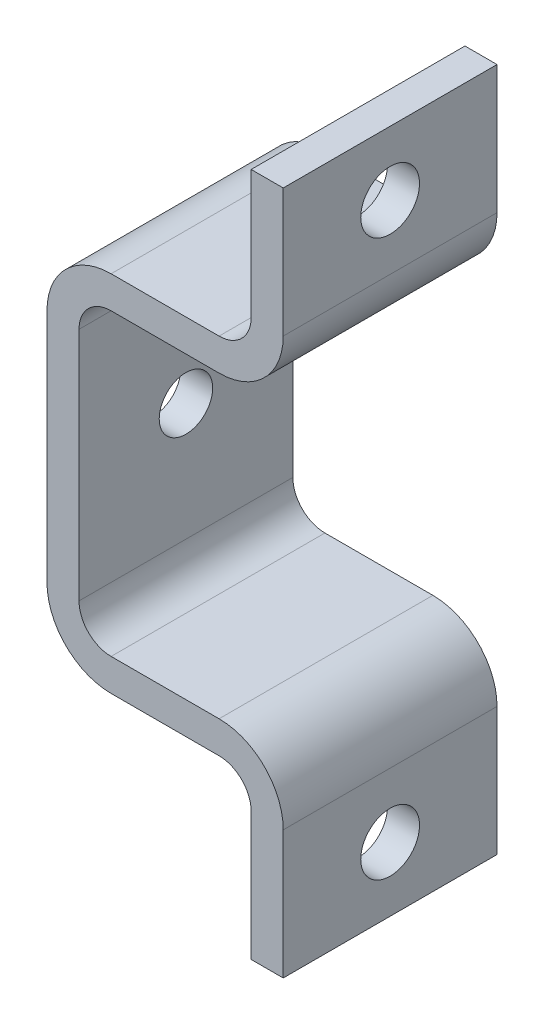
ISO-10303-21;
HEADER;
FILE_DESCRIPTION(('STEP AP214'),'2;1');
FILE_NAME('part.step','',(''),(''),'','','');
FILE_SCHEMA(('AUTOMOTIVE_DESIGN { 1 0 10303 214 1 1 1 1 }'));
ENDSEC;
DATA;
#1=APPLICATION_CONTEXT('core data for automotive mechanical design processes');
#2=APPLICATION_PROTOCOL_DEFINITION('international standard','automotive_design',2000,#1);
#3=PRODUCT_CONTEXT('',#1,'mechanical');
#4=PRODUCT('Part','Part','',(#3));
#5=PRODUCT_RELATED_PRODUCT_CATEGORY('part','',(#4));
#6=PRODUCT_DEFINITION_FORMATION('','',#4);
#7=PRODUCT_DEFINITION_CONTEXT('part definition',#1,'design');
#8=PRODUCT_DEFINITION('design','',#6,#7);
#9=PRODUCT_DEFINITION_SHAPE('','',#8);
#10=(LENGTH_UNIT() NAMED_UNIT(*) SI_UNIT(.MILLI.,.METRE.));
#11=(NAMED_UNIT(*) PLANE_ANGLE_UNIT() SI_UNIT($,.RADIAN.));
#12=(NAMED_UNIT(*) SI_UNIT($,.STERADIAN.) SOLID_ANGLE_UNIT());
#13=UNCERTAINTY_MEASURE_WITH_UNIT(LENGTH_MEASURE(1.E-05),#10,'distance_accuracy_value','');
#14=(GEOMETRIC_REPRESENTATION_CONTEXT(3) GLOBAL_UNCERTAINTY_ASSIGNED_CONTEXT((#13)) GLOBAL_UNIT_ASSIGNED_CONTEXT((#10,
#11,#12)) REPRESENTATION_CONTEXT('',''));
#15=CARTESIAN_POINT('',(0.,0.,0.));
#16=DIRECTION('',(0.,0.,1.));
#17=DIRECTION('',(1.,0.,0.));
#18=AXIS2_PLACEMENT_3D('',#15,#16,#17);
#19=CARTESIAN_POINT('',(3.,14.,10.));
#20=DIRECTION('',(-1.,0.,0.));
#21=DIRECTION('',(0.,0.,1.));
#22=AXIS2_PLACEMENT_3D('',#19,#20,#21);
#23=PLANE('',#22);
#24=CARTESIAN_POINT('',(3.,0.,0.));
#25=DIRECTION('',(-1.,0.,0.));
#26=DIRECTION('',(0.,0.,1.));
#27=AXIS2_PLACEMENT_3D('',#24,#25,#26);
#28=CIRCLE('',#27,2.5);
#29=CARTESIAN_POINT('',(3.,0.,2.5));
#30=VERTEX_POINT('',#29);
#31=EDGE_CURVE('E242',#30,#30,#28,.T.);
#32=ORIENTED_EDGE('',*,*,#31,.T.);
#33=EDGE_LOOP('',(#32));
#34=FACE_BOUND('',#33,.T.);
#35=DIRECTION('',(0.,1.,0.));
#36=VECTOR('',#35,1.);
#37=CARTESIAN_POINT('',(3.,14.,10.));
#38=LINE('',#37,#36);
#39=CARTESIAN_POINT('',(3.,-11.,10.));
#40=VERTEX_POINT('',#39);
#41=CARTESIAN_POINT('',(3.,11.,10.));
#42=VERTEX_POINT('',#41);
#43=EDGE_CURVE('E278',#40,#42,#38,.T.);
#44=ORIENTED_EDGE('',*,*,#43,.F.);
#45=DIRECTION('',(0.,0.,-1.));
#46=VECTOR('',#45,1.);
#47=CARTESIAN_POINT('',(3.,-11.,-10.));
#48=LINE('',#47,#46);
#49=CARTESIAN_POINT('',(3.,-11.,-10.));
#50=VERTEX_POINT('',#49);
#51=EDGE_CURVE('E298',#40,#50,#48,.T.);
#52=ORIENTED_EDGE('',*,*,#51,.T.);
#53=DIRECTION('',(0.,1.,0.));
#54=VECTOR('',#53,1.);
#55=CARTESIAN_POINT('',(3.,14.,-10.));
#56=LINE('',#55,#54);
#57=CARTESIAN_POINT('',(3.,11.,-10.));
#58=VERTEX_POINT('',#57);
#59=EDGE_CURVE('E237',#50,#58,#56,.T.);
#60=ORIENTED_EDGE('',*,*,#59,.T.);
#61=DIRECTION('',(0.,0.,-1.));
#62=VECTOR('',#61,1.);
#63=CARTESIAN_POINT('',(3.,11.,10.));
#64=LINE('',#63,#62);
#65=EDGE_CURVE('E295',#58,#42,#64,.F.);
#66=ORIENTED_EDGE('',*,*,#65,.T.);
#67=EDGE_LOOP('',(#44,#52,#60,#66));
#68=FACE_BOUND('',#67,.T.);
#69=ADVANCED_FACE('F39',(#34,#68),#23,.F.);
#70=CARTESIAN_POINT('',(22.1,14.,10.));
#71=DIRECTION('',(0.,1.,0.));
#72=DIRECTION('',(-1.,0.,0.));
#73=AXIS2_PLACEMENT_3D('',#70,#71,#72);
#74=PLANE('',#73);
#75=DIRECTION('',(1.,0.,0.));
#76=VECTOR('',#75,1.);
#77=CARTESIAN_POINT('',(22.1,14.,-10.));
#78=LINE('',#77,#76);
#79=CARTESIAN_POINT('',(6.,14.,-10.));
#80=VERTEX_POINT('',#79);
#81=CARTESIAN_POINT('',(16.1,14.,-10.));
#82=VERTEX_POINT('',#81);
#83=EDGE_CURVE('E241',#80,#82,#78,.T.);
#84=ORIENTED_EDGE('',*,*,#83,.T.);
#85=DIRECTION('',(0.,0.,-1.));
#86=VECTOR('',#85,1.);
#87=CARTESIAN_POINT('',(16.1,14.,10.));
#88=LINE('',#87,#86);
#89=CARTESIAN_POINT('',(16.1,14.,10.));
#90=VERTEX_POINT('',#89);
#91=EDGE_CURVE('E11',#82,#90,#88,.F.);
#92=ORIENTED_EDGE('',*,*,#91,.T.);
#93=DIRECTION('',(1.,0.,0.));
#94=VECTOR('',#93,1.);
#95=CARTESIAN_POINT('',(22.1,14.,10.));
#96=LINE('',#95,#94);
#97=CARTESIAN_POINT('',(6.,14.,10.));
#98=VERTEX_POINT('',#97);
#99=EDGE_CURVE('E191',#98,#90,#96,.T.);
#100=ORIENTED_EDGE('',*,*,#99,.F.);
#101=DIRECTION('',(0.,0.,-1.));
#102=VECTOR('',#101,1.);
#103=CARTESIAN_POINT('',(6.,14.,-10.));
#104=LINE('',#103,#102);
#105=EDGE_CURVE('E306',#98,#80,#104,.T.);
#106=ORIENTED_EDGE('',*,*,#105,.T.);
#107=EDGE_LOOP('',(#84,#92,#100,#106));
#108=FACE_BOUND('',#107,.T.);
#109=ADVANCED_FACE('F497',(#108),#74,.F.);
#110=CARTESIAN_POINT('',(22.1,32.,10.));
#111=DIRECTION('',(-1.,0.,0.));
#112=DIRECTION('',(0.,-1.,0.));
#113=AXIS2_PLACEMENT_3D('',#110,#111,#112);
#114=PLANE('',#113);
#115=CARTESIAN_POINT('',(22.1,26.,0.));
#116=DIRECTION('',(-1.,0.,0.));
#117=DIRECTION('',(0.,0.,1.));
#118=AXIS2_PLACEMENT_3D('',#115,#116,#117);
#119=CIRCLE('',#118,2.75);
#120=CARTESIAN_POINT('',(22.1,26.,2.75));
#121=VERTEX_POINT('',#120);
#122=EDGE_CURVE('E475',#121,#121,#119,.T.);
#123=ORIENTED_EDGE('',*,*,#122,.T.);
#124=EDGE_LOOP('',(#123));
#125=FACE_BOUND('',#124,.T.);
#126=DIRECTION('',(0.,1.,0.));
#127=VECTOR('',#126,1.);
#128=CARTESIAN_POINT('',(22.1,32.,10.));
#129=LINE('',#128,#127);
#130=CARTESIAN_POINT('',(22.1,20.,10.));
#131=VERTEX_POINT('',#130);
#132=CARTESIAN_POINT('',(22.1,32.,10.));
#133=VERTEX_POINT('',#132);
#134=EDGE_CURVE('E176',#131,#133,#129,.T.);
#135=ORIENTED_EDGE('',*,*,#134,.F.);
#136=DIRECTION('',(0.,0.,-1.));
#137=VECTOR('',#136,1.);
#138=CARTESIAN_POINT('',(22.1,20.,10.));
#139=LINE('',#138,#137);
#140=CARTESIAN_POINT('',(22.1,20.,-10.));
#141=VERTEX_POINT('',#140);
#142=EDGE_CURVE('E48',#131,#141,#139,.T.);
#143=ORIENTED_EDGE('',*,*,#142,.T.);
#144=DIRECTION('',(0.,1.,0.));
#145=VECTOR('',#144,1.);
#146=CARTESIAN_POINT('',(22.1,32.,-10.));
#147=LINE('',#146,#145);
#148=CARTESIAN_POINT('',(22.1,32.,-10.));
#149=VERTEX_POINT('',#148);
#150=EDGE_CURVE('E197',#141,#149,#147,.T.);
#151=ORIENTED_EDGE('',*,*,#150,.T.);
#152=DIRECTION('',(0.,0.,-1.));
#153=VECTOR('',#152,1.);
#154=CARTESIAN_POINT('',(22.1,32.,10.));
#155=LINE('',#154,#153);
#156=EDGE_CURVE('E194',#133,#149,#155,.T.);
#157=ORIENTED_EDGE('',*,*,#156,.F.);
#158=EDGE_LOOP('',(#135,#143,#151,#157));
#159=FACE_BOUND('',#158,.T.);
#160=ADVANCED_FACE('F195',(#125,#159),#114,.F.);
#161=CARTESIAN_POINT('',(19.1,32.,10.));
#162=DIRECTION('',(0.,-1.,0.));
#163=DIRECTION('',(0.,0.,-1.));
#164=AXIS2_PLACEMENT_3D('',#161,#162,#163);
#165=PLANE('',#164);
#166=DIRECTION('',(-1.,0.,0.));
#167=VECTOR('',#166,1.);
#168=CARTESIAN_POINT('',(19.1,32.,-10.));
#169=LINE('',#168,#167);
#170=CARTESIAN_POINT('',(19.1,32.,-10.));
#171=VERTEX_POINT('',#170);
#172=EDGE_CURVE('E248',#149,#171,#169,.T.);
#173=ORIENTED_EDGE('',*,*,#172,.T.);
#174=DIRECTION('',(0.,0.,-1.));
#175=VECTOR('',#174,1.);
#176=CARTESIAN_POINT('',(19.1,32.,10.));
#177=LINE('',#176,#175);
#178=CARTESIAN_POINT('',(19.1,32.,10.));
#179=VERTEX_POINT('',#178);
#180=EDGE_CURVE('E202',#179,#171,#177,.T.);
#181=ORIENTED_EDGE('',*,*,#180,.F.);
#182=DIRECTION('',(-1.,0.,0.));
#183=VECTOR('',#182,1.);
#184=CARTESIAN_POINT('',(19.1,32.,10.));
#185=LINE('',#184,#183);
#186=EDGE_CURVE('E182',#133,#179,#185,.T.);
#187=ORIENTED_EDGE('',*,*,#186,.F.);
#188=ORIENTED_EDGE('',*,*,#156,.T.);
#189=EDGE_LOOP('',(#173,#181,#187,#188));
#190=FACE_BOUND('',#189,.T.);
#191=ADVANCED_FACE('F204',(#190),#165,.F.);
#192=CARTESIAN_POINT('',(19.1,17.,10.));
#193=DIRECTION('',(1.,0.,0.));
#194=DIRECTION('',(0.,0.,-1.));
#195=AXIS2_PLACEMENT_3D('',#192,#193,#194);
#196=PLANE('',#195);
#197=CARTESIAN_POINT('',(19.1,26.,0.));
#198=DIRECTION('',(1.,0.,0.));
#199=DIRECTION('',(0.,0.,-1.));
#200=AXIS2_PLACEMENT_3D('',#197,#198,#199);
#201=CIRCLE('',#200,2.75);
#202=CARTESIAN_POINT('',(19.1,26.,-2.75));
#203=VERTEX_POINT('',#202);
#204=EDGE_CURVE('E471',#203,#203,#201,.T.);
#205=ORIENTED_EDGE('',*,*,#204,.T.);
#206=EDGE_LOOP('',(#205));
#207=FACE_BOUND('',#206,.T.);
#208=DIRECTION('',(0.,-1.,0.));
#209=VECTOR('',#208,1.);
#210=CARTESIAN_POINT('',(19.1,17.,-10.));
#211=LINE('',#210,#209);
#212=CARTESIAN_POINT('',(19.1,20.,-10.));
#213=VERTEX_POINT('',#212);
#214=EDGE_CURVE('E251',#171,#213,#211,.T.);
#215=ORIENTED_EDGE('',*,*,#214,.T.);
#216=DIRECTION('',(0.,0.,-1.));
#217=VECTOR('',#216,1.);
#218=CARTESIAN_POINT('',(19.1,20.,10.));
#219=LINE('',#218,#217);
#220=CARTESIAN_POINT('',(19.1,20.,10.));
#221=VERTEX_POINT('',#220);
#222=EDGE_CURVE('E314',#213,#221,#219,.F.);
#223=ORIENTED_EDGE('',*,*,#222,.T.);
#224=DIRECTION('',(0.,-1.,0.));
#225=VECTOR('',#224,1.);
#226=CARTESIAN_POINT('',(19.1,17.,10.));
#227=LINE('',#226,#225);
#228=EDGE_CURVE('E208',#179,#221,#227,.T.);
#229=ORIENTED_EDGE('',*,*,#228,.F.);
#230=ORIENTED_EDGE('',*,*,#180,.T.);
#231=EDGE_LOOP('',(#215,#223,#229,#230));
#232=FACE_BOUND('',#231,.T.);
#233=ADVANCED_FACE('F392',(#207,#232),#196,.F.);
#234=CARTESIAN_POINT('',(0.,17.,10.));
#235=DIRECTION('',(0.,-1.,0.));
#236=DIRECTION('',(0.,0.,-1.));
#237=AXIS2_PLACEMENT_3D('',#234,#235,#236);
#238=PLANE('',#237);
#239=DIRECTION('',(-1.,0.,0.));
#240=VECTOR('',#239,1.);
#241=CARTESIAN_POINT('',(0.,17.,-10.));
#242=LINE('',#241,#240);
#243=CARTESIAN_POINT('',(16.1,17.,-10.));
#244=VERTEX_POINT('',#243);
#245=CARTESIAN_POINT('',(6.,17.,-10.));
#246=VERTEX_POINT('',#245);
#247=EDGE_CURVE('E255',#244,#246,#242,.T.);
#248=ORIENTED_EDGE('',*,*,#247,.T.);
#249=DIRECTION('',(0.,0.,-1.));
#250=VECTOR('',#249,1.);
#251=CARTESIAN_POINT('',(6.,17.,10.));
#252=LINE('',#251,#250);
#253=CARTESIAN_POINT('',(6.,17.,10.));
#254=VERTEX_POINT('',#253);
#255=EDGE_CURVE('E382',#246,#254,#252,.F.);
#256=ORIENTED_EDGE('',*,*,#255,.T.);
#257=DIRECTION('',(-1.,0.,0.));
#258=VECTOR('',#257,1.);
#259=CARTESIAN_POINT('',(0.,17.,10.));
#260=LINE('',#259,#258);
#261=CARTESIAN_POINT('',(16.1,17.,10.));
#262=VERTEX_POINT('',#261);
#263=EDGE_CURVE('E211',#262,#254,#260,.T.);
#264=ORIENTED_EDGE('',*,*,#263,.F.);
#265=DIRECTION('',(0.,0.,-1.));
#266=VECTOR('',#265,1.);
#267=CARTESIAN_POINT('',(16.1,17.,-10.));
#268=LINE('',#267,#266);
#269=EDGE_CURVE('E310',#262,#244,#268,.T.);
#270=ORIENTED_EDGE('',*,*,#269,.T.);
#271=EDGE_LOOP('',(#248,#256,#264,#270));
#272=FACE_BOUND('',#271,.T.);
#273=ADVANCED_FACE('F401',(#272),#238,.F.);
#274=CARTESIAN_POINT('',(0.,-17.,10.));
#275=DIRECTION('',(1.,0.,0.));
#276=DIRECTION('',(0.,0.,-1.));
#277=AXIS2_PLACEMENT_3D('',#274,#275,#276);
#278=PLANE('',#277);
#279=CARTESIAN_POINT('',(0.,0.,0.));
#280=DIRECTION('',(-1.,0.,0.));
#281=DIRECTION('',(0.,0.,1.));
#282=AXIS2_PLACEMENT_3D('',#279,#280,#281);
#283=CIRCLE('',#282,2.5);
#284=CARTESIAN_POINT('',(0.,0.,2.5));
#285=VERTEX_POINT('',#284);
#286=EDGE_CURVE('E459',#285,#285,#283,.T.);
#287=ORIENTED_EDGE('',*,*,#286,.F.);
#288=EDGE_LOOP('',(#287));
#289=FACE_BOUND('',#288,.T.);
#290=DIRECTION('',(0.,-1.,0.));
#291=VECTOR('',#290,1.);
#292=CARTESIAN_POINT('',(0.,-17.,-10.));
#293=LINE('',#292,#291);
#294=CARTESIAN_POINT('',(0.,11.,-10.));
#295=VERTEX_POINT('',#294);
#296=CARTESIAN_POINT('',(0.,-11.,-10.));
#297=VERTEX_POINT('',#296);
#298=EDGE_CURVE('E259',#295,#297,#293,.T.);
#299=ORIENTED_EDGE('',*,*,#298,.T.);
#300=DIRECTION('',(0.,0.,-1.));
#301=VECTOR('',#300,1.);
#302=CARTESIAN_POINT('',(0.,-11.,10.));
#303=LINE('',#302,#301);
#304=CARTESIAN_POINT('',(0.,-11.,10.));
#305=VERTEX_POINT('',#304);
#306=EDGE_CURVE('E63',#297,#305,#303,.F.);
#307=ORIENTED_EDGE('',*,*,#306,.T.);
#308=DIRECTION('',(0.,-1.,0.));
#309=VECTOR('',#308,1.);
#310=CARTESIAN_POINT('',(0.,-17.,10.));
#311=LINE('',#310,#309);
#312=CARTESIAN_POINT('',(0.,11.,10.));
#313=VERTEX_POINT('',#312);
#314=EDGE_CURVE('E218',#313,#305,#311,.T.);
#315=ORIENTED_EDGE('',*,*,#314,.F.);
#316=DIRECTION('',(0.,0.,-1.));
#317=VECTOR('',#316,1.);
#318=CARTESIAN_POINT('',(0.,11.,10.));
#319=LINE('',#318,#317);
#320=EDGE_CURVE('E376',#313,#295,#319,.T.);
#321=ORIENTED_EDGE('',*,*,#320,.T.);
#322=EDGE_LOOP('',(#299,#307,#315,#321));
#323=FACE_BOUND('',#322,.T.);
#324=ADVANCED_FACE('F408',(#289,#323),#278,.F.);
#325=CARTESIAN_POINT('',(0.,-17.,10.));
#326=DIRECTION('',(0.,1.,0.));
#327=DIRECTION('',(0.,0.,1.));
#328=AXIS2_PLACEMENT_3D('',#325,#326,#327);
#329=PLANE('',#328);
#330=DIRECTION('',(1.,0.,0.));
#331=VECTOR('',#330,1.);
#332=CARTESIAN_POINT('',(0.,-17.,10.));
#333=LINE('',#332,#331);
#334=CARTESIAN_POINT('',(6.,-17.,10.));
#335=VERTEX_POINT('',#334);
#336=CARTESIAN_POINT('',(16.1,-17.,10.));
#337=VERTEX_POINT('',#336);
#338=EDGE_CURVE('E221',#335,#337,#333,.T.);
#339=ORIENTED_EDGE('',*,*,#338,.F.);
#340=DIRECTION('',(0.,0.,-1.));
#341=VECTOR('',#340,1.);
#342=CARTESIAN_POINT('',(6.,-17.,10.));
#343=LINE('',#342,#341);
#344=CARTESIAN_POINT('',(6.,-17.,-10.));
#345=VERTEX_POINT('',#344);
#346=EDGE_CURVE('E372',#335,#345,#343,.T.);
#347=ORIENTED_EDGE('',*,*,#346,.T.);
#348=DIRECTION('',(1.,0.,0.));
#349=VECTOR('',#348,1.);
#350=CARTESIAN_POINT('',(0.,-17.,-10.));
#351=LINE('',#350,#349);
#352=CARTESIAN_POINT('',(16.1,-17.,-10.));
#353=VERTEX_POINT('',#352);
#354=EDGE_CURVE('E262',#345,#353,#351,.T.);
#355=ORIENTED_EDGE('',*,*,#354,.T.);
#356=DIRECTION('',(0.,0.,-1.));
#357=VECTOR('',#356,1.);
#358=CARTESIAN_POINT('',(16.1,-17.,10.));
#359=LINE('',#358,#357);
#360=EDGE_CURVE('E291',#353,#337,#359,.F.);
#361=ORIENTED_EDGE('',*,*,#360,.T.);
#362=EDGE_LOOP('',(#339,#347,#355,#361));
#363=FACE_BOUND('',#362,.T.);
#364=ADVANCED_FACE('F414',(#363),#329,.F.);
#365=CARTESIAN_POINT('',(19.1,-17.,10.));
#366=DIRECTION('',(1.,0.,0.));
#367=DIRECTION('',(0.,0.,-1.));
#368=AXIS2_PLACEMENT_3D('',#365,#366,#367);
#369=PLANE('',#368);
#370=CARTESIAN_POINT('',(19.1,-26.,0.));
#371=DIRECTION('',(1.,0.,0.));
#372=DIRECTION('',(0.,0.,-1.));
#373=AXIS2_PLACEMENT_3D('',#370,#371,#372);
#374=CIRCLE('',#373,2.75);
#375=CARTESIAN_POINT('',(19.1,-26.,-2.75));
#376=VERTEX_POINT('',#375);
#377=EDGE_CURVE('E463',#376,#376,#374,.T.);
#378=ORIENTED_EDGE('',*,*,#377,.T.);
#379=EDGE_LOOP('',(#378));
#380=FACE_BOUND('',#379,.T.);
#381=DIRECTION('',(0.,-1.,0.));
#382=VECTOR('',#381,1.);
#383=CARTESIAN_POINT('',(19.1,-17.,10.));
#384=LINE('',#383,#382);
#385=CARTESIAN_POINT('',(19.1,-20.,10.));
#386=VERTEX_POINT('',#385);
#387=CARTESIAN_POINT('',(19.1,-32.,10.));
#388=VERTEX_POINT('',#387);
#389=EDGE_CURVE('E224',#386,#388,#384,.T.);
#390=ORIENTED_EDGE('',*,*,#389,.F.);
#391=DIRECTION('',(0.,0.,-1.));
#392=VECTOR('',#391,1.);
#393=CARTESIAN_POINT('',(19.1,-20.,-10.));
#394=LINE('',#393,#392);
#395=CARTESIAN_POINT('',(19.1,-20.,-10.));
#396=VERTEX_POINT('',#395);
#397=EDGE_CURVE('E201',#386,#396,#394,.T.);
#398=ORIENTED_EDGE('',*,*,#397,.T.);
#399=DIRECTION('',(0.,-1.,0.));
#400=VECTOR('',#399,1.);
#401=CARTESIAN_POINT('',(19.1,-17.,-10.));
#402=LINE('',#401,#400);
#403=CARTESIAN_POINT('',(19.1,-32.,-10.));
#404=VERTEX_POINT('',#403);
#405=EDGE_CURVE('E265',#396,#404,#402,.T.);
#406=ORIENTED_EDGE('',*,*,#405,.T.);
#407=DIRECTION('',(0.,0.,-1.));
#408=VECTOR('',#407,1.);
#409=CARTESIAN_POINT('',(19.1,-32.,10.));
#410=LINE('',#409,#408);
#411=EDGE_CURVE('E282',#388,#404,#410,.T.);
#412=ORIENTED_EDGE('',*,*,#411,.F.);
#413=EDGE_LOOP('',(#390,#398,#406,#412));
#414=FACE_BOUND('',#413,.T.);
#415=ADVANCED_FACE('F425',(#380,#414),#369,.F.);
#416=CARTESIAN_POINT('',(19.1,-32.,10.));
#417=DIRECTION('',(0.,1.,0.));
#418=DIRECTION('',(0.,0.,1.));
#419=AXIS2_PLACEMENT_3D('',#416,#417,#418);
#420=PLANE('',#419);
#421=DIRECTION('',(1.,0.,0.));
#422=VECTOR('',#421,1.);
#423=CARTESIAN_POINT('',(19.1,-32.,-10.));
#424=LINE('',#423,#422);
#425=CARTESIAN_POINT('',(22.1,-32.,-10.));
#426=VERTEX_POINT('',#425);
#427=EDGE_CURVE('E268',#404,#426,#424,.T.);
#428=ORIENTED_EDGE('',*,*,#427,.T.);
#429=DIRECTION('',(0.,0.,-1.));
#430=VECTOR('',#429,1.);
#431=CARTESIAN_POINT('',(22.1,-32.,10.));
#432=LINE('',#431,#430);
#433=CARTESIAN_POINT('',(22.1,-32.,10.));
#434=VERTEX_POINT('',#433);
#435=EDGE_CURVE('E236',#434,#426,#432,.T.);
#436=ORIENTED_EDGE('',*,*,#435,.F.);
#437=DIRECTION('',(1.,0.,0.));
#438=VECTOR('',#437,1.);
#439=CARTESIAN_POINT('',(19.1,-32.,10.));
#440=LINE('',#439,#438);
#441=EDGE_CURVE('E227',#388,#434,#440,.T.);
#442=ORIENTED_EDGE('',*,*,#441,.F.);
#443=ORIENTED_EDGE('',*,*,#411,.T.);
#444=EDGE_LOOP('',(#428,#436,#442,#443));
#445=FACE_BOUND('',#444,.T.);
#446=ADVANCED_FACE('F429',(#445),#420,.F.);
#447=CARTESIAN_POINT('',(22.1,-32.,10.));
#448=DIRECTION('',(-1.,0.,0.));
#449=DIRECTION('',(0.,-1.,0.));
#450=AXIS2_PLACEMENT_3D('',#447,#448,#449);
#451=PLANE('',#450);
#452=CARTESIAN_POINT('',(22.1,-26.,0.));
#453=DIRECTION('',(-1.,0.,0.));
#454=DIRECTION('',(0.,0.,1.));
#455=AXIS2_PLACEMENT_3D('',#452,#453,#454);
#456=CIRCLE('',#455,2.75);
#457=CARTESIAN_POINT('',(22.1,-26.,2.75));
#458=VERTEX_POINT('',#457);
#459=EDGE_CURVE('E467',#458,#458,#456,.T.);
#460=ORIENTED_EDGE('',*,*,#459,.T.);
#461=EDGE_LOOP('',(#460));
#462=FACE_BOUND('',#461,.T.);
#463=DIRECTION('',(0.,1.,0.));
#464=VECTOR('',#463,1.);
#465=CARTESIAN_POINT('',(22.1,-32.,-10.));
#466=LINE('',#465,#464);
#467=CARTESIAN_POINT('',(22.1,-20.,-10.));
#468=VERTEX_POINT('',#467);
#469=EDGE_CURVE('E271',#426,#468,#466,.T.);
#470=ORIENTED_EDGE('',*,*,#469,.T.);
#471=DIRECTION('',(0.,0.,-1.));
#472=VECTOR('',#471,1.);
#473=CARTESIAN_POINT('',(22.1,-20.,10.));
#474=LINE('',#473,#472);
#475=CARTESIAN_POINT('',(22.1,-20.,10.));
#476=VERTEX_POINT('',#475);
#477=EDGE_CURVE('E359',#468,#476,#474,.F.);
#478=ORIENTED_EDGE('',*,*,#477,.T.);
#479=DIRECTION('',(0.,1.,0.));
#480=VECTOR('',#479,1.);
#481=CARTESIAN_POINT('',(22.1,-32.,10.));
#482=LINE('',#481,#480);
#483=EDGE_CURVE('E230',#434,#476,#482,.T.);
#484=ORIENTED_EDGE('',*,*,#483,.F.);
#485=ORIENTED_EDGE('',*,*,#435,.T.);
#486=EDGE_LOOP('',(#470,#478,#484,#485));
#487=FACE_BOUND('',#486,.T.);
#488=ADVANCED_FACE('F546',(#462,#487),#451,.F.);
#489=CARTESIAN_POINT('',(22.1,-14.,10.));
#490=DIRECTION('',(0.,-1.,0.));
#491=DIRECTION('',(1.,0.,0.));
#492=AXIS2_PLACEMENT_3D('',#489,#490,#491);
#493=PLANE('',#492);
#494=DIRECTION('',(-1.,0.,0.));
#495=VECTOR('',#494,1.);
#496=CARTESIAN_POINT('',(22.1,-14.,10.));
#497=LINE('',#496,#495);
#498=CARTESIAN_POINT('',(16.1,-14.,10.));
#499=VERTEX_POINT('',#498);
#500=CARTESIAN_POINT('',(6.,-14.,10.));
#501=VERTEX_POINT('',#500);
#502=EDGE_CURVE('E233',#499,#501,#497,.T.);
#503=ORIENTED_EDGE('',*,*,#502,.F.);
#504=DIRECTION('',(0.,0.,-1.));
#505=VECTOR('',#504,1.);
#506=CARTESIAN_POINT('',(16.1,-14.,10.));
#507=LINE('',#506,#505);
#508=CARTESIAN_POINT('',(16.1,-14.,-10.));
#509=VERTEX_POINT('',#508);
#510=EDGE_CURVE('E343',#499,#509,#507,.T.);
#511=ORIENTED_EDGE('',*,*,#510,.T.);
#512=DIRECTION('',(-1.,0.,0.));
#513=VECTOR('',#512,1.);
#514=CARTESIAN_POINT('',(22.1,-14.,-10.));
#515=LINE('',#514,#513);
#516=CARTESIAN_POINT('',(6.,-14.,-10.));
#517=VERTEX_POINT('',#516);
#518=EDGE_CURVE('E275',#509,#517,#515,.T.);
#519=ORIENTED_EDGE('',*,*,#518,.T.);
#520=DIRECTION('',(0.,0.,-1.));
#521=VECTOR('',#520,1.);
#522=CARTESIAN_POINT('',(6.,-14.,10.));
#523=LINE('',#522,#521);
#524=EDGE_CURVE('E302',#517,#501,#523,.F.);
#525=ORIENTED_EDGE('',*,*,#524,.T.);
#526=EDGE_LOOP('',(#503,#511,#519,#525));
#527=FACE_BOUND('',#526,.T.);
#528=ADVANCED_FACE('F439',(#527),#493,.F.);
#529=CARTESIAN_POINT('',(0.,0.,10.));
#530=DIRECTION('',(0.,0.,-1.));
#531=DIRECTION('',(-1.,0.,0.));
#532=AXIS2_PLACEMENT_3D('',#529,#530,#531);
#533=PLANE('',#532);
#534=ORIENTED_EDGE('',*,*,#483,.T.);
#535=CARTESIAN_POINT('',(16.1,-20.,10.));
#536=DIRECTION('',(0.,0.,-1.));
#537=DIRECTION('',(-1.,0.,0.));
#538=AXIS2_PLACEMENT_3D('',#535,#536,#537);
#539=CIRCLE('',#538,6.);
#540=EDGE_CURVE('E369',#476,#499,#539,.F.);
#541=ORIENTED_EDGE('',*,*,#540,.T.);
#542=ORIENTED_EDGE('',*,*,#502,.T.);
#543=CARTESIAN_POINT('',(6.,-11.,10.));
#544=DIRECTION('',(0.,0.,-1.));
#545=DIRECTION('',(-1.,0.,0.));
#546=AXIS2_PLACEMENT_3D('',#543,#544,#545);
#547=CIRCLE('',#546,3.);
#548=EDGE_CURVE('E328',#501,#40,#547,.T.);
#549=ORIENTED_EDGE('',*,*,#548,.T.);
#550=ORIENTED_EDGE('',*,*,#43,.T.);
#551=CARTESIAN_POINT('',(6.,11.,10.));
#552=DIRECTION('',(0.,0.,-1.));
#553=DIRECTION('',(-1.,0.,0.));
#554=AXIS2_PLACEMENT_3D('',#551,#552,#553);
#555=CIRCLE('',#554,3.);
#556=EDGE_CURVE('E334',#42,#98,#555,.T.);
#557=ORIENTED_EDGE('',*,*,#556,.T.);
#558=ORIENTED_EDGE('',*,*,#99,.T.);
#559=CARTESIAN_POINT('',(16.1,20.,10.));
#560=DIRECTION('',(0.,0.,-1.));
#561=DIRECTION('',(-1.,0.,0.));
#562=AXIS2_PLACEMENT_3D('',#559,#560,#561);
#563=CIRCLE('',#562,6.);
#564=EDGE_CURVE('E186',#90,#131,#563,.F.);
#565=ORIENTED_EDGE('',*,*,#564,.T.);
#566=ORIENTED_EDGE('',*,*,#134,.T.);
#567=ORIENTED_EDGE('',*,*,#186,.T.);
#568=ORIENTED_EDGE('',*,*,#228,.T.);
#569=CARTESIAN_POINT('',(16.1,20.,10.));
#570=DIRECTION('',(0.,0.,-1.));
#571=DIRECTION('',(-1.,0.,0.));
#572=AXIS2_PLACEMENT_3D('',#569,#570,#571);
#573=CIRCLE('',#572,3.);
#574=EDGE_CURVE('E340',#221,#262,#573,.T.);
#575=ORIENTED_EDGE('',*,*,#574,.T.);
#576=ORIENTED_EDGE('',*,*,#263,.T.);
#577=CARTESIAN_POINT('',(6.,11.,10.));
#578=DIRECTION('',(0.,0.,-1.));
#579=DIRECTION('',(-1.,0.,0.));
#580=AXIS2_PLACEMENT_3D('',#577,#578,#579);
#581=CIRCLE('',#580,6.);
#582=EDGE_CURVE('E364',#254,#313,#581,.F.);
#583=ORIENTED_EDGE('',*,*,#582,.T.);
#584=ORIENTED_EDGE('',*,*,#314,.T.);
#585=CARTESIAN_POINT('',(6.,-11.,10.));
#586=DIRECTION('',(0.,0.,-1.));
#587=DIRECTION('',(-1.,0.,0.));
#588=AXIS2_PLACEMENT_3D('',#585,#586,#587);
#589=CIRCLE('',#588,6.);
#590=EDGE_CURVE('E55',#305,#335,#589,.F.);
#591=ORIENTED_EDGE('',*,*,#590,.T.);
#592=ORIENTED_EDGE('',*,*,#338,.T.);
#593=CARTESIAN_POINT('',(16.1,-20.,10.));
#594=DIRECTION('',(0.,0.,-1.));
#595=DIRECTION('',(-1.,0.,0.));
#596=AXIS2_PLACEMENT_3D('',#593,#594,#595);
#597=CIRCLE('',#596,3.);
#598=EDGE_CURVE('E321',#337,#386,#597,.T.);
#599=ORIENTED_EDGE('',*,*,#598,.T.);
#600=ORIENTED_EDGE('',*,*,#389,.T.);
#601=ORIENTED_EDGE('',*,*,#441,.T.);
#602=EDGE_LOOP('',(#534,#541,#542,#549,#550,#557,#558,#565,#566,#567,#568,#575,#576,#583,#584,
#591,#592,#599,#600,#601));
#603=FACE_BOUND('',#602,.T.);
#604=ADVANCED_FACE('F179',(#603),#533,.F.);
#605=CARTESIAN_POINT('',(0.,0.,-10.));
#606=DIRECTION('',(0.,0.,-1.));
#607=DIRECTION('',(-1.,0.,0.));
#608=AXIS2_PLACEMENT_3D('',#605,#606,#607);
#609=PLANE('',#608);
#610=ORIENTED_EDGE('',*,*,#518,.F.);
#611=CARTESIAN_POINT('',(16.1,-20.,-10.));
#612=DIRECTION('',(0.,0.,-1.));
#613=DIRECTION('',(-1.,0.,0.));
#614=AXIS2_PLACEMENT_3D('',#611,#612,#613);
#615=CIRCLE('',#614,6.);
#616=EDGE_CURVE('E356',#509,#468,#615,.T.);
#617=ORIENTED_EDGE('',*,*,#616,.T.);
#618=ORIENTED_EDGE('',*,*,#469,.F.);
#619=ORIENTED_EDGE('',*,*,#427,.F.);
#620=ORIENTED_EDGE('',*,*,#405,.F.);
#621=CARTESIAN_POINT('',(16.1,-20.,-10.));
#622=DIRECTION('',(0.,0.,-1.));
#623=DIRECTION('',(-1.,0.,0.));
#624=AXIS2_PLACEMENT_3D('',#621,#622,#623);
#625=CIRCLE('',#624,3.);
#626=EDGE_CURVE('E317',#396,#353,#625,.F.);
#627=ORIENTED_EDGE('',*,*,#626,.T.);
#628=ORIENTED_EDGE('',*,*,#354,.F.);
#629=CARTESIAN_POINT('',(6.,-11.,-10.));
#630=DIRECTION('',(0.,0.,-1.));
#631=DIRECTION('',(-1.,0.,0.));
#632=AXIS2_PLACEMENT_3D('',#629,#630,#631);
#633=CIRCLE('',#632,6.);
#634=EDGE_CURVE('E353',#345,#297,#633,.T.);
#635=ORIENTED_EDGE('',*,*,#634,.T.);
#636=ORIENTED_EDGE('',*,*,#298,.F.);
#637=CARTESIAN_POINT('',(6.,11.,-10.));
#638=DIRECTION('',(0.,0.,-1.));
#639=DIRECTION('',(-1.,0.,0.));
#640=AXIS2_PLACEMENT_3D('',#637,#638,#639);
#641=CIRCLE('',#640,6.);
#642=EDGE_CURVE('E350',#295,#246,#641,.T.);
#643=ORIENTED_EDGE('',*,*,#642,.T.);
#644=ORIENTED_EDGE('',*,*,#247,.F.);
#645=CARTESIAN_POINT('',(16.1,20.,-10.));
#646=DIRECTION('',(0.,0.,-1.));
#647=DIRECTION('',(-1.,0.,0.));
#648=AXIS2_PLACEMENT_3D('',#645,#646,#647);
#649=CIRCLE('',#648,3.);
#650=EDGE_CURVE('E337',#244,#213,#649,.F.);
#651=ORIENTED_EDGE('',*,*,#650,.T.);
#652=ORIENTED_EDGE('',*,*,#214,.F.);
#653=ORIENTED_EDGE('',*,*,#172,.F.);
#654=ORIENTED_EDGE('',*,*,#150,.F.);
#655=CARTESIAN_POINT('',(16.1,20.,-10.));
#656=DIRECTION('',(0.,0.,-1.));
#657=DIRECTION('',(-1.,0.,0.));
#658=AXIS2_PLACEMENT_3D('',#655,#656,#657);
#659=CIRCLE('',#658,6.);
#660=EDGE_CURVE('E347',#141,#82,#659,.T.);
#661=ORIENTED_EDGE('',*,*,#660,.T.);
#662=ORIENTED_EDGE('',*,*,#83,.F.);
#663=CARTESIAN_POINT('',(6.,11.,-10.));
#664=DIRECTION('',(0.,0.,-1.));
#665=DIRECTION('',(-1.,0.,0.));
#666=AXIS2_PLACEMENT_3D('',#663,#664,#665);
#667=CIRCLE('',#666,3.);
#668=EDGE_CURVE('E331',#80,#58,#667,.F.);
#669=ORIENTED_EDGE('',*,*,#668,.T.);
#670=ORIENTED_EDGE('',*,*,#59,.F.);
#671=CARTESIAN_POINT('',(6.,-11.,-10.));
#672=DIRECTION('',(0.,0.,-1.));
#673=DIRECTION('',(-1.,0.,0.));
#674=AXIS2_PLACEMENT_3D('',#671,#672,#673);
#675=CIRCLE('',#674,3.);
#676=EDGE_CURVE('E324',#50,#517,#675,.F.);
#677=ORIENTED_EDGE('',*,*,#676,.T.);
#678=EDGE_LOOP('',(#610,#617,#618,#619,#620,#627,#628,#635,#636,#643,#644,#651,#652,#653,#654,
#661,#662,#669,#670,#677));
#679=FACE_BOUND('',#678,.T.);
#680=ADVANCED_FACE('F388',(#679),#609,.T.);
#681=CARTESIAN_POINT('',(16.1,-20.,10.));
#682=DIRECTION('',(0.,0.,1.));
#683=DIRECTION('',(1.,0.,0.));
#684=AXIS2_PLACEMENT_3D('',#681,#682,#683);
#685=CYLINDRICAL_SURFACE('',#684,3.);
#686=ORIENTED_EDGE('',*,*,#598,.F.);
#687=ORIENTED_EDGE('',*,*,#360,.F.);
#688=ORIENTED_EDGE('',*,*,#626,.F.);
#689=ORIENTED_EDGE('',*,*,#397,.F.);
#690=EDGE_LOOP('',(#686,#687,#688,#689));
#691=FACE_BOUND('',#690,.T.);
#692=ADVANCED_FACE('F421',(#691),#685,.F.);
#693=CARTESIAN_POINT('',(6.,-11.,10.));
#694=DIRECTION('',(0.,0.,1.));
#695=DIRECTION('',(1.,0.,0.));
#696=AXIS2_PLACEMENT_3D('',#693,#694,#695);
#697=CYLINDRICAL_SURFACE('',#696,3.);
#698=ORIENTED_EDGE('',*,*,#548,.F.);
#699=ORIENTED_EDGE('',*,*,#524,.F.);
#700=ORIENTED_EDGE('',*,*,#676,.F.);
#701=ORIENTED_EDGE('',*,*,#51,.F.);
#702=EDGE_LOOP('',(#698,#699,#700,#701));
#703=FACE_BOUND('',#702,.T.);
#704=ADVANCED_FACE('F446',(#703),#697,.F.);
#705=CARTESIAN_POINT('',(6.,11.,10.));
#706=DIRECTION('',(0.,0.,1.));
#707=DIRECTION('',(1.,0.,0.));
#708=AXIS2_PLACEMENT_3D('',#705,#706,#707);
#709=CYLINDRICAL_SURFACE('',#708,3.);
#710=ORIENTED_EDGE('',*,*,#556,.F.);
#711=ORIENTED_EDGE('',*,*,#65,.F.);
#712=ORIENTED_EDGE('',*,*,#668,.F.);
#713=ORIENTED_EDGE('',*,*,#105,.F.);
#714=EDGE_LOOP('',(#710,#711,#712,#713));
#715=FACE_BOUND('',#714,.T.);
#716=ADVANCED_FACE('F511',(#715),#709,.F.);
#717=CARTESIAN_POINT('',(16.1,20.,10.));
#718=DIRECTION('',(0.,0.,1.));
#719=DIRECTION('',(1.,0.,0.));
#720=AXIS2_PLACEMENT_3D('',#717,#718,#719);
#721=CYLINDRICAL_SURFACE('',#720,3.);
#722=ORIENTED_EDGE('',*,*,#574,.F.);
#723=ORIENTED_EDGE('',*,*,#222,.F.);
#724=ORIENTED_EDGE('',*,*,#650,.F.);
#725=ORIENTED_EDGE('',*,*,#269,.F.);
#726=EDGE_LOOP('',(#722,#723,#724,#725));
#727=FACE_BOUND('',#726,.T.);
#728=ADVANCED_FACE('F398',(#727),#721,.F.);
#729=CARTESIAN_POINT('',(16.1,-20.,10.));
#730=DIRECTION('',(0.,0.,-1.));
#731=DIRECTION('',(-1.,0.,0.));
#732=AXIS2_PLACEMENT_3D('',#729,#730,#731);
#733=CYLINDRICAL_SURFACE('',#732,6.);
#734=ORIENTED_EDGE('',*,*,#540,.F.);
#735=ORIENTED_EDGE('',*,*,#477,.F.);
#736=ORIENTED_EDGE('',*,*,#616,.F.);
#737=ORIENTED_EDGE('',*,*,#510,.F.);
#738=EDGE_LOOP('',(#734,#735,#736,#737));
#739=FACE_BOUND('',#738,.T.);
#740=ADVANCED_FACE('F437',(#739),#733,.T.);
#741=CARTESIAN_POINT('',(6.,-11.,10.));
#742=DIRECTION('',(0.,0.,-1.));
#743=DIRECTION('',(-1.,0.,0.));
#744=AXIS2_PLACEMENT_3D('',#741,#742,#743);
#745=CYLINDRICAL_SURFACE('',#744,6.);
#746=ORIENTED_EDGE('',*,*,#590,.F.);
#747=ORIENTED_EDGE('',*,*,#306,.F.);
#748=ORIENTED_EDGE('',*,*,#634,.F.);
#749=ORIENTED_EDGE('',*,*,#346,.F.);
#750=EDGE_LOOP('',(#746,#747,#748,#749));
#751=FACE_BOUND('',#750,.T.);
#752=ADVANCED_FACE('F411',(#751),#745,.T.);
#753=CARTESIAN_POINT('',(6.,11.,10.));
#754=DIRECTION('',(0.,0.,-1.));
#755=DIRECTION('',(-1.,0.,0.));
#756=AXIS2_PLACEMENT_3D('',#753,#754,#755);
#757=CYLINDRICAL_SURFACE('',#756,6.);
#758=ORIENTED_EDGE('',*,*,#582,.F.);
#759=ORIENTED_EDGE('',*,*,#255,.F.);
#760=ORIENTED_EDGE('',*,*,#642,.F.);
#761=ORIENTED_EDGE('',*,*,#320,.F.);
#762=EDGE_LOOP('',(#758,#759,#760,#761));
#763=FACE_BOUND('',#762,.T.);
#764=ADVANCED_FACE('F407',(#763),#757,.T.);
#765=CARTESIAN_POINT('',(16.1,20.,10.));
#766=DIRECTION('',(0.,0.,-1.));
#767=DIRECTION('',(-1.,0.,0.));
#768=AXIS2_PLACEMENT_3D('',#765,#766,#767);
#769=CYLINDRICAL_SURFACE('',#768,6.);
#770=ORIENTED_EDGE('',*,*,#564,.F.);
#771=ORIENTED_EDGE('',*,*,#91,.F.);
#772=ORIENTED_EDGE('',*,*,#660,.F.);
#773=ORIENTED_EDGE('',*,*,#142,.F.);
#774=EDGE_LOOP('',(#770,#771,#772,#773));
#775=FACE_BOUND('',#774,.T.);
#776=ADVANCED_FACE('F41',(#775),#769,.T.);
#777=CARTESIAN_POINT('',(22.1,0.,0.));
#778=DIRECTION('',(-1.,0.,0.));
#779=DIRECTION('',(0.,0.,1.));
#780=AXIS2_PLACEMENT_3D('',#777,#778,#779);
#781=CYLINDRICAL_SURFACE('',#780,2.5);
#782=ORIENTED_EDGE('',*,*,#286,.T.);
#783=EDGE_LOOP('',(#782));
#784=FACE_BOUND('',#783,.T.);
#785=ORIENTED_EDGE('',*,*,#31,.F.);
#786=EDGE_LOOP('',(#785));
#787=FACE_BOUND('',#786,.T.);
#788=ADVANCED_FACE('F524',(#784,#787),#781,.F.);
#789=CARTESIAN_POINT('',(0.,-26.,0.));
#790=DIRECTION('',(-1.,0.,0.));
#791=DIRECTION('',(0.,0.,1.));
#792=AXIS2_PLACEMENT_3D('',#789,#790,#791);
#793=CYLINDRICAL_SURFACE('',#792,2.75);
#794=ORIENTED_EDGE('',*,*,#459,.F.);
#795=EDGE_LOOP('',(#794));
#796=FACE_BOUND('',#795,.T.);
#797=ORIENTED_EDGE('',*,*,#377,.F.);
#798=EDGE_LOOP('',(#797));
#799=FACE_BOUND('',#798,.T.);
#800=ADVANCED_FACE('F484',(#796,#799),#793,.F.);
#801=CARTESIAN_POINT('',(0.,26.,0.));
#802=DIRECTION('',(-1.,0.,0.));
#803=DIRECTION('',(0.,0.,1.));
#804=AXIS2_PLACEMENT_3D('',#801,#802,#803);
#805=CYLINDRICAL_SURFACE('',#804,2.75);
#806=ORIENTED_EDGE('',*,*,#122,.F.);
#807=EDGE_LOOP('',(#806));
#808=FACE_BOUND('',#807,.T.);
#809=ORIENTED_EDGE('',*,*,#204,.F.);
#810=EDGE_LOOP('',(#809));
#811=FACE_BOUND('',#810,.T.);
#812=ADVANCED_FACE('F481',(#808,#811),#805,.F.);
#813=CLOSED_SHELL('',(#69,#109,#160,#191,#233,#273,#324,#364,#415,#446,#488,#528,#604,#680,#692,
#704,#716,#728,#740,#752,#764,#776,#788,#800,#812));
#814=MANIFOLD_SOLID_BREP('B2',#813);
#815=ADVANCED_BREP_SHAPE_REPRESENTATION('',(#18,#814),#14);
#816=SHAPE_DEFINITION_REPRESENTATION(#9,#815);
ENDSEC;
END-ISO-10303-21;
